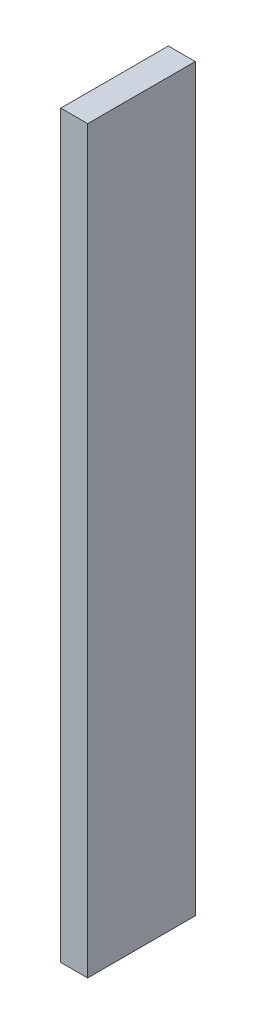
ISO-10303-21;
HEADER;
FILE_DESCRIPTION(('STEP AP214'),'2;1');
FILE_NAME('part.step','',(''),(''),'','','');
FILE_SCHEMA(('AUTOMOTIVE_DESIGN { 1 0 10303 214 1 1 1 1 }'));
ENDSEC;
DATA;
#1=APPLICATION_CONTEXT('core data for automotive mechanical design processes');
#2=APPLICATION_PROTOCOL_DEFINITION('international standard','automotive_design',2000,#1);
#3=PRODUCT_CONTEXT('',#1,'mechanical');
#4=PRODUCT('Part','Part','',(#3));
#5=PRODUCT_RELATED_PRODUCT_CATEGORY('part','',(#4));
#6=PRODUCT_DEFINITION_FORMATION('','',#4);
#7=PRODUCT_DEFINITION_CONTEXT('part definition',#1,'design');
#8=PRODUCT_DEFINITION('design','',#6,#7);
#9=PRODUCT_DEFINITION_SHAPE('','',#8);
#10=(LENGTH_UNIT() NAMED_UNIT(*) SI_UNIT(.MILLI.,.METRE.));
#11=(NAMED_UNIT(*) PLANE_ANGLE_UNIT() SI_UNIT($,.RADIAN.));
#12=(NAMED_UNIT(*) SI_UNIT($,.STERADIAN.) SOLID_ANGLE_UNIT());
#13=UNCERTAINTY_MEASURE_WITH_UNIT(LENGTH_MEASURE(1.E-05),#10,'distance_accuracy_value','');
#14=(GEOMETRIC_REPRESENTATION_CONTEXT(3) GLOBAL_UNCERTAINTY_ASSIGNED_CONTEXT((#13)) GLOBAL_UNIT_ASSIGNED_CONTEXT((#10,
#11,#12)) REPRESENTATION_CONTEXT('',''));
#15=CARTESIAN_POINT('',(0.,0.,0.));
#16=DIRECTION('',(0.,0.,1.));
#17=DIRECTION('',(1.,0.,0.));
#18=AXIS2_PLACEMENT_3D('',#15,#16,#17);
#19=CARTESIAN_POINT('',(8.,0.,16.));
#20=DIRECTION('',(0.,0.,-1.));
#21=DIRECTION('',(-1.,0.,0.));
#22=AXIS2_PLACEMENT_3D('',#19,#20,#21);
#23=PLANE('',#22);
#24=DIRECTION('',(0.,-1.,0.));
#25=VECTOR('',#24,1.);
#26=CARTESIAN_POINT('',(0.,0.,16.));
#27=LINE('',#26,#25);
#28=CARTESIAN_POINT('',(0.,220.,16.));
#29=VERTEX_POINT('',#28);
#30=CARTESIAN_POINT('',(0.,0.,16.));
#31=VERTEX_POINT('',#30);
#32=EDGE_CURVE('E109',#29,#31,#27,.T.);
#33=ORIENTED_EDGE('',*,*,#32,.T.);
#34=DIRECTION('',(-1.,0.,0.));
#35=VECTOR('',#34,1.);
#36=CARTESIAN_POINT('',(8.,0.,16.));
#37=LINE('',#36,#35);
#38=CARTESIAN_POINT('',(8.,0.,16.));
#39=VERTEX_POINT('',#38);
#40=EDGE_CURVE('E11',#39,#31,#37,.T.);
#41=ORIENTED_EDGE('',*,*,#40,.F.);
#42=DIRECTION('',(0.,-1.,0.));
#43=VECTOR('',#42,1.);
#44=CARTESIAN_POINT('',(8.,0.,16.));
#45=LINE('',#44,#43);
#46=CARTESIAN_POINT('',(8.,220.,16.));
#47=VERTEX_POINT('',#46);
#48=EDGE_CURVE('E93',#47,#39,#45,.T.);
#49=ORIENTED_EDGE('',*,*,#48,.F.);
#50=DIRECTION('',(-1.,0.,0.));
#51=VECTOR('',#50,1.);
#52=CARTESIAN_POINT('',(8.,220.,16.));
#53=LINE('',#52,#51);
#54=EDGE_CURVE('E105',#47,#29,#53,.T.);
#55=ORIENTED_EDGE('',*,*,#54,.T.);
#56=EDGE_LOOP('',(#33,#41,#49,#55));
#57=FACE_BOUND('',#56,.T.);
#58=ADVANCED_FACE('F41',(#57),#23,.F.);
#59=CARTESIAN_POINT('',(8.,0.,16.));
#60=DIRECTION('',(0.,1.,0.));
#61=DIRECTION('',(0.,0.,1.));
#62=AXIS2_PLACEMENT_3D('',#59,#60,#61);
#63=PLANE('',#62);
#64=DIRECTION('',(0.,0.,-1.));
#65=VECTOR('',#64,1.);
#66=CARTESIAN_POINT('',(0.,0.,16.));
#67=LINE('',#66,#65);
#68=CARTESIAN_POINT('',(0.,0.,-16.));
#69=VERTEX_POINT('',#68);
#70=EDGE_CURVE('E98',#31,#69,#67,.T.);
#71=ORIENTED_EDGE('',*,*,#70,.T.);
#72=DIRECTION('',(-1.,0.,0.));
#73=VECTOR('',#72,1.);
#74=CARTESIAN_POINT('',(8.,0.,-16.));
#75=LINE('',#74,#73);
#76=CARTESIAN_POINT('',(8.,0.,-16.));
#77=VERTEX_POINT('',#76);
#78=EDGE_CURVE('E50',#77,#69,#75,.T.);
#79=ORIENTED_EDGE('',*,*,#78,.F.);
#80=DIRECTION('',(0.,0.,-1.));
#81=VECTOR('',#80,1.);
#82=CARTESIAN_POINT('',(8.,0.,16.));
#83=LINE('',#82,#81);
#84=EDGE_CURVE('E88',#39,#77,#83,.T.);
#85=ORIENTED_EDGE('',*,*,#84,.F.);
#86=ORIENTED_EDGE('',*,*,#40,.T.);
#87=EDGE_LOOP('',(#71,#79,#85,#86));
#88=FACE_BOUND('',#87,.T.);
#89=ADVANCED_FACE('F97',(#88),#63,.F.);
#90=CARTESIAN_POINT('',(8.,0.,-16.));
#91=DIRECTION('',(0.,0.,1.));
#92=DIRECTION('',(1.,0.,0.));
#93=AXIS2_PLACEMENT_3D('',#90,#91,#92);
#94=PLANE('',#93);
#95=DIRECTION('',(0.,1.,0.));
#96=VECTOR('',#95,1.);
#97=CARTESIAN_POINT('',(0.,0.,-16.));
#98=LINE('',#97,#96);
#99=CARTESIAN_POINT('',(0.,220.,-16.));
#100=VERTEX_POINT('',#99);
#101=EDGE_CURVE('E75',#69,#100,#98,.T.);
#102=ORIENTED_EDGE('',*,*,#101,.T.);
#103=DIRECTION('',(-1.,0.,0.));
#104=VECTOR('',#103,1.);
#105=CARTESIAN_POINT('',(8.,220.,-16.));
#106=LINE('',#105,#104);
#107=CARTESIAN_POINT('',(8.,220.,-16.));
#108=VERTEX_POINT('',#107);
#109=EDGE_CURVE('E100',#108,#100,#106,.T.);
#110=ORIENTED_EDGE('',*,*,#109,.F.);
#111=DIRECTION('',(0.,1.,0.));
#112=VECTOR('',#111,1.);
#113=CARTESIAN_POINT('',(8.,0.,-16.));
#114=LINE('',#113,#112);
#115=EDGE_CURVE('E91',#77,#108,#114,.T.);
#116=ORIENTED_EDGE('',*,*,#115,.F.);
#117=ORIENTED_EDGE('',*,*,#78,.T.);
#118=EDGE_LOOP('',(#102,#110,#116,#117));
#119=FACE_BOUND('',#118,.T.);
#120=ADVANCED_FACE('F101',(#119),#94,.F.);
#121=CARTESIAN_POINT('',(8.,220.,16.));
#122=DIRECTION('',(0.,-1.,0.));
#123=DIRECTION('',(0.,0.,-1.));
#124=AXIS2_PLACEMENT_3D('',#121,#122,#123);
#125=PLANE('',#124);
#126=DIRECTION('',(0.,0.,1.));
#127=VECTOR('',#126,1.);
#128=CARTESIAN_POINT('',(0.,220.,16.));
#129=LINE('',#128,#127);
#130=EDGE_CURVE('E81',#100,#29,#129,.T.);
#131=ORIENTED_EDGE('',*,*,#130,.T.);
#132=ORIENTED_EDGE('',*,*,#54,.F.);
#133=DIRECTION('',(0.,0.,1.));
#134=VECTOR('',#133,1.);
#135=CARTESIAN_POINT('',(8.,220.,16.));
#136=LINE('',#135,#134);
#137=EDGE_CURVE('E58',#108,#47,#136,.T.);
#138=ORIENTED_EDGE('',*,*,#137,.F.);
#139=ORIENTED_EDGE('',*,*,#109,.T.);
#140=EDGE_LOOP('',(#131,#132,#138,#139));
#141=FACE_BOUND('',#140,.T.);
#142=ADVANCED_FACE('F122',(#141),#125,.F.);
#143=CARTESIAN_POINT('',(8.,0.,0.));
#144=DIRECTION('',(-1.,0.,0.));
#145=DIRECTION('',(0.,0.,1.));
#146=AXIS2_PLACEMENT_3D('',#143,#144,#145);
#147=PLANE('',#146);
#148=ORIENTED_EDGE('',*,*,#48,.T.);
#149=ORIENTED_EDGE('',*,*,#84,.T.);
#150=ORIENTED_EDGE('',*,*,#115,.T.);
#151=ORIENTED_EDGE('',*,*,#137,.T.);
#152=EDGE_LOOP('',(#148,#149,#150,#151));
#153=FACE_BOUND('',#152,.T.);
#154=ADVANCED_FACE('F89',(#153),#147,.F.);
#155=CARTESIAN_POINT('',(0.,0.,0.));
#156=DIRECTION('',(-1.,0.,0.));
#157=DIRECTION('',(0.,0.,1.));
#158=AXIS2_PLACEMENT_3D('',#155,#156,#157);
#159=PLANE('',#158);
#160=ORIENTED_EDGE('',*,*,#32,.F.);
#161=ORIENTED_EDGE('',*,*,#130,.F.);
#162=ORIENTED_EDGE('',*,*,#101,.F.);
#163=ORIENTED_EDGE('',*,*,#70,.F.);
#164=EDGE_LOOP('',(#160,#161,#162,#163));
#165=FACE_BOUND('',#164,.T.);
#166=ADVANCED_FACE('F125',(#165),#159,.T.);
#167=CLOSED_SHELL('',(#58,#89,#120,#142,#154,#166));
#168=MANIFOLD_SOLID_BREP('B2',#167);
#169=ADVANCED_BREP_SHAPE_REPRESENTATION('',(#18,#168),#14);
#170=SHAPE_DEFINITION_REPRESENTATION(#9,#169);
ENDSEC;
END-ISO-10303-21;
